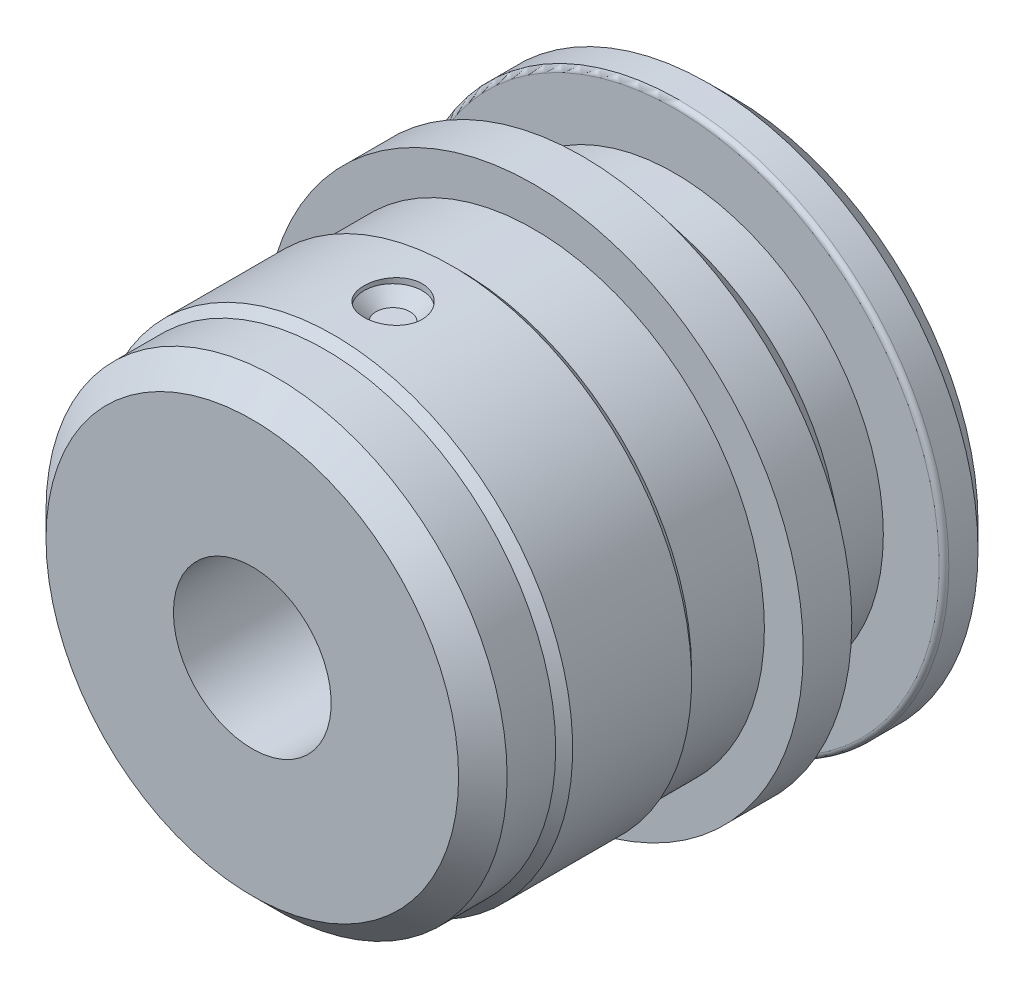
ISO-10303-21;
HEADER;
FILE_DESCRIPTION(('STEP AP214'),'2;1');
FILE_NAME('part.step','',(''),(''),'','','');
FILE_SCHEMA(('AUTOMOTIVE_DESIGN { 1 0 10303 214 1 1 1 1 }'));
ENDSEC;
DATA;
#1=APPLICATION_CONTEXT('core data for automotive mechanical design processes');
#2=APPLICATION_PROTOCOL_DEFINITION('international standard','automotive_design',2000,#1);
#3=PRODUCT_CONTEXT('',#1,'mechanical');
#4=PRODUCT('Part','Part','',(#3));
#5=PRODUCT_RELATED_PRODUCT_CATEGORY('part','',(#4));
#6=PRODUCT_DEFINITION_FORMATION('','',#4);
#7=PRODUCT_DEFINITION_CONTEXT('part definition',#1,'design');
#8=PRODUCT_DEFINITION('design','',#6,#7);
#9=PRODUCT_DEFINITION_SHAPE('','',#8);
#10=(LENGTH_UNIT() NAMED_UNIT(*) SI_UNIT(.MILLI.,.METRE.));
#11=(NAMED_UNIT(*) PLANE_ANGLE_UNIT() SI_UNIT($,.RADIAN.));
#12=(NAMED_UNIT(*) SI_UNIT($,.STERADIAN.) SOLID_ANGLE_UNIT());
#13=UNCERTAINTY_MEASURE_WITH_UNIT(LENGTH_MEASURE(1.E-05),#10,'distance_accuracy_value','');
#14=(GEOMETRIC_REPRESENTATION_CONTEXT(3) GLOBAL_UNCERTAINTY_ASSIGNED_CONTEXT((#13)) GLOBAL_UNIT_ASSIGNED_CONTEXT((#10,
#11,#12)) REPRESENTATION_CONTEXT('',''));
#15=CARTESIAN_POINT('',(0.,0.,0.));
#16=DIRECTION('',(0.,0.,1.));
#17=DIRECTION('',(1.,0.,0.));
#18=AXIS2_PLACEMENT_3D('',#15,#16,#17);
#19=CARTESIAN_POINT('',(11.1,0.,2.4));
#20=DIRECTION('',(0.,0.,-1.));
#21=DIRECTION('',(-1.,0.,0.));
#22=AXIS2_PLACEMENT_3D('',#19,#20,#21);
#23=PLANE('',#22);
#24=CARTESIAN_POINT('',(0.,0.,2.4));
#25=DIRECTION('',(0.,0.,-1.));
#26=DIRECTION('',(-1.,0.,0.));
#27=AXIS2_PLACEMENT_3D('',#24,#25,#26);
#28=CIRCLE('',#27,10.9);
#29=CARTESIAN_POINT('',(-10.9,0.,2.4));
#30=VERTEX_POINT('',#29);
#31=EDGE_CURVE('E86',#30,#30,#28,.F.);
#32=ORIENTED_EDGE('',*,*,#31,.T.);
#33=EDGE_LOOP('',(#32));
#34=FACE_BOUND('',#33,.T.);
#35=CARTESIAN_POINT('',(0.,0.,2.4));
#36=DIRECTION('',(0.,0.,-1.));
#37=DIRECTION('',(-1.,0.,0.));
#38=AXIS2_PLACEMENT_3D('',#35,#36,#37);
#39=CIRCLE('',#38,8.6);
#40=CARTESIAN_POINT('',(-8.6,0.,2.4));
#41=VERTEX_POINT('',#40);
#42=EDGE_CURVE('E85',#41,#41,#39,.T.);
#43=ORIENTED_EDGE('',*,*,#42,.T.);
#44=EDGE_LOOP('',(#43));
#45=FACE_BOUND('',#44,.T.);
#46=ADVANCED_FACE('F31',(#34,#45),#23,.F.);
#47=CARTESIAN_POINT('',(0.,0.,0.));
#48=DIRECTION('',(0.,0.,-1.));
#49=DIRECTION('',(-1.,0.,0.));
#50=AXIS2_PLACEMENT_3D('',#47,#48,#49);
#51=CYLINDRICAL_SURFACE('',#50,11.1);
#52=CARTESIAN_POINT('',(0.,0.,2.2));
#53=DIRECTION('',(0.,0.,-1.));
#54=DIRECTION('',(-1.,0.,0.));
#55=AXIS2_PLACEMENT_3D('',#52,#53,#54);
#56=CIRCLE('',#55,11.1);
#57=CARTESIAN_POINT('',(-11.1,0.,2.2));
#58=VERTEX_POINT('',#57);
#59=EDGE_CURVE('E91',#58,#58,#56,.T.);
#60=ORIENTED_EDGE('',*,*,#59,.T.);
#61=EDGE_LOOP('',(#60));
#62=FACE_BOUND('',#61,.T.);
#63=CARTESIAN_POINT('',(0.,0.,1.));
#64=DIRECTION('',(0.,0.,1.));
#65=DIRECTION('',(1.,0.,0.));
#66=AXIS2_PLACEMENT_3D('',#63,#64,#65);
#67=CIRCLE('',#66,11.1);
#68=CARTESIAN_POINT('',(11.1,0.,1.));
#69=VERTEX_POINT('',#68);
#70=EDGE_CURVE('E95',#69,#69,#67,.T.);
#71=ORIENTED_EDGE('',*,*,#70,.T.);
#72=EDGE_LOOP('',(#71));
#73=FACE_BOUND('',#72,.T.);
#74=ADVANCED_FACE('F220',(#62,#73),#51,.T.);
#75=CARTESIAN_POINT('',(11.1,0.,0.));
#76=DIRECTION('',(0.,0.,1.));
#77=DIRECTION('',(1.,0.,0.));
#78=AXIS2_PLACEMENT_3D('',#75,#76,#77);
#79=PLANE('',#78);
#80=CARTESIAN_POINT('',(0.,0.,0.));
#81=DIRECTION('',(0.,0.,1.));
#82=DIRECTION('',(1.,0.,0.));
#83=AXIS2_PLACEMENT_3D('',#80,#81,#82);
#84=CIRCLE('',#83,10.1);
#85=CARTESIAN_POINT('',(10.1,0.,0.));
#86=VERTEX_POINT('',#85);
#87=EDGE_CURVE('E99',#86,#86,#84,.F.);
#88=ORIENTED_EDGE('',*,*,#87,.T.);
#89=EDGE_LOOP('',(#88));
#90=FACE_BOUND('',#89,.T.);
#91=CARTESIAN_POINT('',(0.,0.,0.));
#92=DIRECTION('',(0.,0.,1.));
#93=DIRECTION('',(1.,0.,0.));
#94=AXIS2_PLACEMENT_3D('',#91,#92,#93);
#95=CIRCLE('',#94,7.1);
#96=CARTESIAN_POINT('',(7.1,0.,0.));
#97=VERTEX_POINT('',#96);
#98=EDGE_CURVE('E104',#97,#97,#95,.T.);
#99=ORIENTED_EDGE('',*,*,#98,.T.);
#100=EDGE_LOOP('',(#99));
#101=FACE_BOUND('',#100,.T.);
#102=ADVANCED_FACE('F225',(#90,#101),#79,.F.);
#103=CARTESIAN_POINT('',(0.,0.,0.));
#104=DIRECTION('',(0.,0.,-1.));
#105=DIRECTION('',(-1.,0.,0.));
#106=AXIS2_PLACEMENT_3D('',#103,#104,#105);
#107=CYLINDRICAL_SURFACE('',#106,6.1);
#108=CARTESIAN_POINT('',(0.,0.,0.999999999999999));
#109=DIRECTION('',(0.,0.,1.));
#110=DIRECTION('',(1.,0.,0.));
#111=AXIS2_PLACEMENT_3D('',#108,#109,#110);
#112=CIRCLE('',#111,6.1);
#113=CARTESIAN_POINT('',(6.1,0.,0.999999999999999));
#114=VERTEX_POINT('',#113);
#115=EDGE_CURVE('E107',#114,#114,#112,.F.);
#116=ORIENTED_EDGE('',*,*,#115,.T.);
#117=EDGE_LOOP('',(#116));
#118=FACE_BOUND('',#117,.T.);
#119=CARTESIAN_POINT('',(0.,0.,7.77653718043598));
#120=DIRECTION('',(0.,0.,-1.));
#121=DIRECTION('',(-1.,0.,0.));
#122=AXIS2_PLACEMENT_3D('',#119,#120,#121);
#123=CIRCLE('',#122,6.1);
#124=CARTESIAN_POINT('',(-6.1,0.,7.77653718043598));
#125=VERTEX_POINT('',#124);
#126=EDGE_CURVE('E116',#125,#125,#123,.T.);
#127=ORIENTED_EDGE('',*,*,#126,.F.);
#128=EDGE_LOOP('',(#127));
#129=FACE_BOUND('',#128,.T.);
#130=ADVANCED_FACE('F410',(#118,#129),#107,.F.);
#131=CARTESIAN_POINT('',(0.,0.,7.77653718043598));
#132=DIRECTION('',(0.,0.,-1.));
#133=DIRECTION('',(-1.,0.,0.));
#134=AXIS2_PLACEMENT_3D('',#131,#132,#133);
#135=CONICAL_SURFACE('',#134,6.1,1.30899693899575);
#136=CARTESIAN_POINT('',(0.,0.,8.5));
#137=DIRECTION('',(0.,0.,-1.));
#138=DIRECTION('',(-1.,0.,0.));
#139=AXIS2_PLACEMENT_3D('',#136,#137,#138);
#140=CIRCLE('',#139,3.4);
#141=CARTESIAN_POINT('',(-3.4,0.,8.5));
#142=VERTEX_POINT('',#141);
#143=EDGE_CURVE('E119',#142,#142,#140,.T.);
#144=ORIENTED_EDGE('',*,*,#143,.F.);
#145=EDGE_LOOP('',(#144));
#146=FACE_BOUND('',#145,.T.);
#147=ORIENTED_EDGE('',*,*,#126,.T.);
#148=EDGE_LOOP('',(#147));
#149=FACE_BOUND('',#148,.T.);
#150=ADVANCED_FACE('F401',(#146,#149),#135,.F.);
#151=CARTESIAN_POINT('',(0.,0.,0.));
#152=DIRECTION('',(0.,0.,-1.));
#153=DIRECTION('',(-1.,0.,0.));
#154=AXIS2_PLACEMENT_3D('',#151,#152,#153);
#155=CYLINDRICAL_SURFACE('',#154,3.4);
#156=CARTESIAN_POINT('',(0.,0.,10.));
#157=DIRECTION('',(0.,0.,-1.));
#158=DIRECTION('',(-1.,0.,0.));
#159=AXIS2_PLACEMENT_3D('',#156,#157,#158);
#160=CIRCLE('',#159,3.4);
#161=CARTESIAN_POINT('',(-3.4,0.,10.));
#162=VERTEX_POINT('',#161);
#163=EDGE_CURVE('E122',#162,#162,#160,.T.);
#164=ORIENTED_EDGE('',*,*,#163,.F.);
#165=EDGE_LOOP('',(#164));
#166=FACE_BOUND('',#165,.T.);
#167=ORIENTED_EDGE('',*,*,#143,.T.);
#168=EDGE_LOOP('',(#167));
#169=FACE_BOUND('',#168,.T.);
#170=ADVANCED_FACE('F392',(#166,#169),#155,.F.);
#171=CARTESIAN_POINT('',(4.4,0.,10.));
#172=DIRECTION('',(0.,0.,-1.));
#173=DIRECTION('',(-1.,0.,0.));
#174=AXIS2_PLACEMENT_3D('',#171,#172,#173);
#175=PLANE('',#174);
#176=CARTESIAN_POINT('',(0.,0.,10.));
#177=DIRECTION('',(0.,0.,-1.));
#178=DIRECTION('',(-1.,0.,0.));
#179=AXIS2_PLACEMENT_3D('',#176,#177,#178);
#180=CIRCLE('',#179,4.4);
#181=CARTESIAN_POINT('',(-4.4,0.,10.));
#182=VERTEX_POINT('',#181);
#183=EDGE_CURVE('E125',#182,#182,#180,.T.);
#184=ORIENTED_EDGE('',*,*,#183,.F.);
#185=EDGE_LOOP('',(#184));
#186=FACE_BOUND('',#185,.T.);
#187=ORIENTED_EDGE('',*,*,#163,.T.);
#188=EDGE_LOOP('',(#187));
#189=FACE_BOUND('',#188,.T.);
#190=ADVANCED_FACE('F383',(#186,#189),#175,.F.);
#191=CARTESIAN_POINT('',(0.,0.,0.));
#192=DIRECTION('',(0.,0.,-1.));
#193=DIRECTION('',(-1.,0.,0.));
#194=AXIS2_PLACEMENT_3D('',#191,#192,#193);
#195=CYLINDRICAL_SURFACE('',#194,4.4);
#196=CARTESIAN_POINT('',(0.,0.,11.8));
#197=DIRECTION('',(0.,0.,-1.));
#198=DIRECTION('',(-1.,0.,0.));
#199=AXIS2_PLACEMENT_3D('',#196,#197,#198);
#200=CIRCLE('',#199,4.4);
#201=CARTESIAN_POINT('',(-4.4,0.,11.8));
#202=VERTEX_POINT('',#201);
#203=EDGE_CURVE('E128',#202,#202,#200,.T.);
#204=ORIENTED_EDGE('',*,*,#203,.F.);
#205=EDGE_LOOP('',(#204));
#206=FACE_BOUND('',#205,.T.);
#207=ORIENTED_EDGE('',*,*,#183,.T.);
#208=EDGE_LOOP('',(#207));
#209=FACE_BOUND('',#208,.T.);
#210=ADVANCED_FACE('F374',(#206,#209),#195,.F.);
#211=CARTESIAN_POINT('',(3.25,0.,11.8));
#212=DIRECTION('',(0.,0.,1.));
#213=DIRECTION('',(1.,0.,0.));
#214=AXIS2_PLACEMENT_3D('',#211,#212,#213);
#215=PLANE('',#214);
#216=CARTESIAN_POINT('',(0.,0.,11.8));
#217=DIRECTION('',(0.,0.,-1.));
#218=DIRECTION('',(-1.,0.,0.));
#219=AXIS2_PLACEMENT_3D('',#216,#217,#218);
#220=CIRCLE('',#219,3.25);
#221=CARTESIAN_POINT('',(-3.25,0.,11.8));
#222=VERTEX_POINT('',#221);
#223=EDGE_CURVE('E131',#222,#222,#220,.T.);
#224=ORIENTED_EDGE('',*,*,#223,.F.);
#225=EDGE_LOOP('',(#224));
#226=FACE_BOUND('',#225,.T.);
#227=ORIENTED_EDGE('',*,*,#203,.T.);
#228=EDGE_LOOP('',(#227));
#229=FACE_BOUND('',#228,.T.);
#230=ADVANCED_FACE('F365',(#226,#229),#215,.F.);
#231=CARTESIAN_POINT('',(0.,0.,0.));
#232=DIRECTION('',(0.,0.,-1.));
#233=DIRECTION('',(-1.,0.,0.));
#234=AXIS2_PLACEMENT_3D('',#231,#232,#233);
#235=CYLINDRICAL_SURFACE('',#234,3.25);
#236=CARTESIAN_POINT('',(0.,0.,19.8));
#237=DIRECTION('',(0.,0.,-1.));
#238=DIRECTION('',(-1.,0.,0.));
#239=AXIS2_PLACEMENT_3D('',#236,#237,#238);
#240=CIRCLE('',#239,3.25);
#241=CARTESIAN_POINT('',(-3.25,0.,19.8));
#242=VERTEX_POINT('',#241);
#243=EDGE_CURVE('E134',#242,#242,#240,.T.);
#244=ORIENTED_EDGE('',*,*,#243,.F.);
#245=EDGE_LOOP('',(#244));
#246=FACE_BOUND('',#245,.T.);
#247=ORIENTED_EDGE('',*,*,#223,.T.);
#248=EDGE_LOOP('',(#247));
#249=FACE_BOUND('',#248,.T.);
#250=ADVANCED_FACE('F216',(#246,#249),#235,.F.);
#251=CARTESIAN_POINT('',(9.5,0.,19.8));
#252=DIRECTION('',(0.,0.,-1.));
#253=DIRECTION('',(-1.,0.,0.));
#254=AXIS2_PLACEMENT_3D('',#251,#252,#253);
#255=PLANE('',#254);
#256=CARTESIAN_POINT('',(0.,0.,19.8));
#257=DIRECTION('',(0.,0.,-1.));
#258=DIRECTION('',(-1.,0.,0.));
#259=AXIS2_PLACEMENT_3D('',#256,#257,#258);
#260=CIRCLE('',#259,8.49999999999999);
#261=CARTESIAN_POINT('',(-8.49999999999999,0.,19.8));
#262=VERTEX_POINT('',#261);
#263=EDGE_CURVE('E110',#262,#262,#260,.F.);
#264=ORIENTED_EDGE('',*,*,#263,.T.);
#265=EDGE_LOOP('',(#264));
#266=FACE_BOUND('',#265,.T.);
#267=ORIENTED_EDGE('',*,*,#243,.T.);
#268=EDGE_LOOP('',(#267));
#269=FACE_BOUND('',#268,.T.);
#270=ADVANCED_FACE('F210',(#266,#269),#255,.F.);
#271=CARTESIAN_POINT('',(0.,0.,0.));
#272=DIRECTION('',(0.,0.,-1.));
#273=DIRECTION('',(-1.,0.,0.));
#274=AXIS2_PLACEMENT_3D('',#271,#272,#273);
#275=CYLINDRICAL_SURFACE('',#274,9.5);
#276=CARTESIAN_POINT('',(0.,0.,18.8));
#277=DIRECTION('',(0.,0.,-1.));
#278=DIRECTION('',(-1.,0.,0.));
#279=AXIS2_PLACEMENT_3D('',#276,#277,#278);
#280=CIRCLE('',#279,9.5);
#281=CARTESIAN_POINT('',(-9.5,0.,18.8));
#282=VERTEX_POINT('',#281);
#283=EDGE_CURVE('E113',#282,#282,#280,.T.);
#284=ORIENTED_EDGE('',*,*,#283,.T.);
#285=EDGE_LOOP('',(#284));
#286=FACE_BOUND('',#285,.T.);
#287=CARTESIAN_POINT('',(0.,0.,16.8));
#288=DIRECTION('',(0.,0.,-1.));
#289=DIRECTION('',(-1.,0.,0.));
#290=AXIS2_PLACEMENT_3D('',#287,#288,#289);
#291=CIRCLE('',#290,9.5);
#292=CARTESIAN_POINT('',(-9.5,0.,16.8));
#293=VERTEX_POINT('',#292);
#294=EDGE_CURVE('E137',#293,#293,#291,.T.);
#295=ORIENTED_EDGE('',*,*,#294,.F.);
#296=EDGE_LOOP('',(#295));
#297=FACE_BOUND('',#296,.T.);
#298=ADVANCED_FACE('F206',(#286,#297),#275,.T.);
#299=CARTESIAN_POINT('',(0.,0.,16.8));
#300=DIRECTION('',(0.,0.,-1.));
#301=DIRECTION('',(-1.,0.,0.));
#302=AXIS2_PLACEMENT_3D('',#299,#300,#301);
#303=CONICAL_SURFACE('',#302,9.5,0.785398163397443);
#304=CARTESIAN_POINT('',(0.,0.,16.45));
#305=DIRECTION('',(0.,0.,-1.));
#306=DIRECTION('',(-1.,0.,0.));
#307=AXIS2_PLACEMENT_3D('',#304,#305,#306);
#308=CIRCLE('',#307,9.85);
#309=CARTESIAN_POINT('',(-9.85,0.,16.45));
#310=VERTEX_POINT('',#309);
#311=EDGE_CURVE('E140',#310,#310,#308,.T.);
#312=ORIENTED_EDGE('',*,*,#311,.F.);
#313=EDGE_LOOP('',(#312));
#314=FACE_BOUND('',#313,.T.);
#315=ORIENTED_EDGE('',*,*,#294,.T.);
#316=EDGE_LOOP('',(#315));
#317=FACE_BOUND('',#316,.T.);
#318=ADVANCED_FACE('F200',(#314,#317),#303,.T.);
#319=CARTESIAN_POINT('',(0.,0.,0.));
#320=DIRECTION('',(0.,0.,-1.));
#321=DIRECTION('',(-1.,0.,0.));
#322=AXIS2_PLACEMENT_3D('',#319,#320,#321);
#323=CYLINDRICAL_SURFACE('',#322,9.85);
#324=CARTESIAN_POINT('',(0.,-9.85,12.8));
#325=CARTESIAN_POINT('',(-0.0671377185985207,-9.84999908293056,12.8000028606161));
#326=CARTESIAN_POINT('',(-0.134317729761524,-9.84930632720313,12.8056533348861));
#327=CARTESIAN_POINT('',(-0.266809321399453,-9.84660941983754,12.8281055312784));
#328=CARTESIAN_POINT('',(-0.332118860467236,-9.84460388841967,12.8449189864056));
#329=CARTESIAN_POINT('',(-0.458932165591949,-9.8395074269213,12.8891952533967));
#330=CARTESIAN_POINT('',(-0.520438425625705,-9.83641721718293,12.9166509989034));
#331=CARTESIAN_POINT('',(-0.637958284699054,-9.82949534897751,12.9814172559376));
#332=CARTESIAN_POINT('',(-0.693972844321678,-9.8256638205284,13.0187260397847));
#333=CARTESIAN_POINT('',(-0.799224743193288,-9.81766484518081,13.1023484533448));
#334=CARTESIAN_POINT('',(-0.848429163515683,-9.81349591114417,13.1487033785698));
#335=CARTESIAN_POINT('',(-0.938380616288529,-9.80530402197336,13.2490136218257));
#336=CARTESIAN_POINT('',(-0.979127223481776,-9.80128107418774,13.3029693217932));
#337=CARTESIAN_POINT('',(-1.05112827113454,-9.79382195364935,13.4171624542512));
#338=CARTESIAN_POINT('',(-1.08235200238518,-9.79038769456096,13.4774193852716));
#339=CARTESIAN_POINT('',(-1.13422486131294,-9.78451427231854,13.602370308685));
#340=CARTESIAN_POINT('',(-1.15487437033634,-9.78207507327955,13.6670641409711));
#341=CARTESIAN_POINT('',(-1.18491289113473,-9.77848206482136,13.7987114825229));
#342=CARTESIAN_POINT('',(-1.19435737113612,-9.77732192571284,13.8656521596227));
#343=CARTESIAN_POINT('',(-1.20188935333566,-9.77639898988791,14.0001776667796));
#344=CARTESIAN_POINT('',(-1.19997729013388,-9.77663613969908,14.0677624720879));
#345=CARTESIAN_POINT('',(-1.18489602004375,-9.77847519504789,14.2012717708085));
#346=CARTESIAN_POINT('',(-1.17178783855338,-9.78006970203688,14.2672032740522));
#347=CARTESIAN_POINT('',(-1.13478160337879,-9.78443227006642,14.395923719483));
#348=CARTESIAN_POINT('',(-1.11088334111317,-9.78720035379313,14.4587126008945));
#349=CARTESIAN_POINT('',(-1.05290949051725,-9.7936065898717,14.5795554827863));
#350=CARTESIAN_POINT('',(-1.01880730612138,-9.79724701093192,14.637596598745));
#351=CARTESIAN_POINT('',(-0.941412684469814,-9.8049859636982,14.74715521603));
#352=CARTESIAN_POINT('',(-0.898119847834306,-9.80908451530866,14.7986724337048));
#353=CARTESIAN_POINT('',(-0.803234274918892,-9.81731082809601,14.8940751374107));
#354=CARTESIAN_POINT('',(-0.75158892359161,-9.82143860441445,14.937908309267));
#355=CARTESIAN_POINT('',(-0.641645716504017,-9.82923306959032,15.016291587785));
#356=CARTESIAN_POINT('',(-0.583347846683675,-9.83289975747321,15.0508416748264));
#357=CARTESIAN_POINT('',(-0.46171469061125,-9.83936102492705,15.1096777750772));
#358=CARTESIAN_POINT('',(-0.398377846398791,-9.84215533344873,15.1339605990649));
#359=CARTESIAN_POINT('',(-0.268484100338869,-9.84655450607394,15.1715317873972));
#360=CARTESIAN_POINT('',(-0.201927341783418,-9.84815942305578,15.1848206405179));
#361=CARTESIAN_POINT('',(-0.0679355003103079,-9.8499921206294,15.1999590618947));
#362=CARTESIAN_POINT('',(-0.000508675264120705,-9.85022857878567,15.2018807126924));
#363=CARTESIAN_POINT('',(0.133706056938548,-9.84932112311176,15.1944202820746));
#364=CARTESIAN_POINT('',(0.20049397697724,-9.84817723717276,15.1850384290573));
#365=CARTESIAN_POINT('',(0.33132298797583,-9.84464304687738,15.1552971788268));
#366=CARTESIAN_POINT('',(0.395371986809384,-9.84225663597672,15.1349720656113));
#367=CARTESIAN_POINT('',(0.51915222018376,-9.83650464302615,15.083956837001));
#368=CARTESIAN_POINT('',(0.578883314762917,-9.83313902925386,15.0532663858042));
#369=CARTESIAN_POINT('',(0.692654673183801,-9.82578238744328,14.9822166657875));
#370=CARTESIAN_POINT('',(0.746665558161899,-9.82178837005377,14.9418106676151));
#371=CARTESIAN_POINT('',(0.847164635228302,-9.81363129231413,14.8525430641395));
#372=CARTESIAN_POINT('',(0.893652544073803,-9.80946822560661,14.8036811406108));
#373=CARTESIAN_POINT('',(0.978041039516859,-9.80141556980202,14.6985715869543));
#374=CARTESIAN_POINT('',(1.01589390886892,-9.79752757853287,14.6422855062806));
#375=CARTESIAN_POINT('',(1.08160839752346,-9.79049131260463,14.5241123995343));
#376=CARTESIAN_POINT('',(1.10947020859656,-9.78734302374792,14.462225480994));
#377=CARTESIAN_POINT('',(1.15433406632193,-9.78215339772391,14.3347627463981));
#378=CARTESIAN_POINT('',(1.17136322234709,-9.7801092992047,14.2691965894044));
#379=CARTESIAN_POINT('',(1.1941657728976,-9.7773514915479,14.1361089406534));
#380=CARTESIAN_POINT('',(1.1999396627369,-9.77663772386609,14.068587535074));
#381=CARTESIAN_POINT('',(1.20005900351757,-9.77662303762594,13.933980724396));
#382=CARTESIAN_POINT('',(1.19447941730302,-9.77731285172967,13.8668953743946));
#383=CARTESIAN_POINT('',(1.17220871453953,-9.78000770334934,13.7346234007073));
#384=CARTESIAN_POINT('',(1.15551759499052,-9.78201274122038,13.6694367775341));
#385=CARTESIAN_POINT('',(1.11152069391402,-9.78710929833492,13.5428212615948));
#386=CARTESIAN_POINT('',(1.08421833218436,-9.79020046750858,13.4813911655472));
#387=CARTESIAN_POINT('',(1.01978135822545,-9.79712158807961,13.3639723969704));
#388=CARTESIAN_POINT('',(0.982646647259557,-9.80095154689582,13.3079837790924));
#389=CARTESIAN_POINT('',(0.899320411809733,-9.80894901369803,13.2026538843235));
#390=CARTESIAN_POINT('',(0.853072999585296,-9.81311850645845,13.1533569679635));
#391=CARTESIAN_POINT('',(0.752950230093834,-9.82130762172921,13.0631942983423));
#392=CARTESIAN_POINT('',(0.699073073319642,-9.82532720860025,13.0223305396797));
#393=CARTESIAN_POINT('',(0.584997669833548,-9.83277957590307,12.9500693031996));
#394=CARTESIAN_POINT('',(0.524777257633643,-9.83621018054586,12.918706610989));
#395=CARTESIAN_POINT('',(0.399917027781265,-9.84207583512778,12.8665833640675));
#396=CARTESIAN_POINT('',(0.335282125484097,-9.84451197193271,12.8458112285934));
#397=CARTESIAN_POINT('',(0.225256910035417,-9.84752347186931,12.8204599274828));
#398=CARTESIAN_POINT('',(0.180561835431385,-9.84844767262355,12.8127984050464));
#399=CARTESIAN_POINT('',(0.090584256447808,-9.84968624399239,12.8025674937005));
#400=CARTESIAN_POINT('',(0.0453017561099382,-9.85000061880054,12.7999980697746));
#401=CARTESIAN_POINT('',(0.,-9.85,12.8));
#402=B_SPLINE_CURVE_WITH_KNOTS('',3,(#324,#325,#326,#327,#328,#329,#330,#331,#332,#333,#334,
#335,#336,#337,#338,#339,#340,#341,#342,#343,#344,#345,#346,#347,#348,#349,#350,#351,#352,#353,
#354,#355,#356,#357,#358,#359,#360,#361,#362,#363,#364,#365,#366,#367,#368,#369,#370,#371,#372,
#373,#374,#375,#376,#377,#378,#379,#380,#381,#382,#383,#384,#385,#386,#387,#388,#389,#390,#391,
#392,#393,#394,#395,#396,#397,#398,#399,#400,#401),.UNSPECIFIED.,.T.,.F.,(4,2,2,2,2,2,2,2,2,2,2,
2,2,2,2,2,2,2,2,2,2,2,2,2,2,2,2,2,2,2,2,2,2,2,2,2,2,2,4),(0.,0.201247689589877,
0.402707238910202,0.604033249942407,0.805323982888943,1.0075560584704,1.20979829977966,
1.41268599569169,1.61556637419407,1.81743818733101,2.01930227514757,2.22007305594732,
2.42084771798253,2.62215031750565,2.82346166642505,3.02609441849326,3.22872759883169,
3.43142367501863,3.63411073914626,3.83551111946903,4.03690743037027,4.237676429844,
4.4384519341806,4.64021314650143,4.84198195343924,5.04484009256853,5.24769433778484,
5.45003890987788,5.65237457713001,5.85337863143019,6.05438274000059,6.25532212248441,
6.45626352288154,6.65847796019348,6.86074017030486,7.06373420030186,7.26650577786762,
7.40230033025888,7.53809394883577),.UNSPECIFIED.);
#403=CARTESIAN_POINT('',(0.,-9.85,12.8));
#404=VERTEX_POINT('',#403);
#405=EDGE_CURVE('E49',#404,#404,#402,.T.);
#406=ORIENTED_EDGE('',*,*,#405,.T.);
#407=EDGE_LOOP('',(#406));
#408=FACE_BOUND('',#407,.T.);
#409=CARTESIAN_POINT('',(0.,9.85,15.2));
#410=CARTESIAN_POINT('',(-0.0671377185985173,9.84999908293056,15.1999971393839));
#411=CARTESIAN_POINT('',(-0.13431772976152,9.84930632720313,15.1943466651139));
#412=CARTESIAN_POINT('',(-0.266809321399449,9.84660941983754,15.1718944687216));
#413=CARTESIAN_POINT('',(-0.332118860467232,9.84460388841967,15.1550810135944));
#414=CARTESIAN_POINT('',(-0.458932165591945,9.8395074269213,15.1108047466033));
#415=CARTESIAN_POINT('',(-0.520438425625702,9.83641721718293,15.0833490010966));
#416=CARTESIAN_POINT('',(-0.63795828469905,9.82949534897751,15.0185827440624));
#417=CARTESIAN_POINT('',(-0.693972844321674,9.8256638205284,14.9812739602153));
#418=CARTESIAN_POINT('',(-0.799224743193284,9.81766484518081,14.8976515466552));
#419=CARTESIAN_POINT('',(-0.848429163515679,9.81349591114417,14.8512966214302));
#420=CARTESIAN_POINT('',(-0.938380616288525,9.80530402197336,14.7509863781743));
#421=CARTESIAN_POINT('',(-0.979127223481772,9.80128107418774,14.6970306782068));
#422=CARTESIAN_POINT('',(-1.05112827113454,9.79382195364935,14.5828375457488));
#423=CARTESIAN_POINT('',(-1.08235200238518,9.79038769456096,14.5225806147284));
#424=CARTESIAN_POINT('',(-1.13422486131294,9.78451427231854,14.397629691315));
#425=CARTESIAN_POINT('',(-1.15487437033633,9.78207507327955,14.3329358590289));
#426=CARTESIAN_POINT('',(-1.18491289113473,9.77848206482136,14.2012885174771));
#427=CARTESIAN_POINT('',(-1.19435737113611,9.77732192571284,14.1343478403773));
#428=CARTESIAN_POINT('',(-1.20188935333566,9.77639898988791,13.9998223332204));
#429=CARTESIAN_POINT('',(-1.19997729013387,9.77663613969909,13.9322375279121));
#430=CARTESIAN_POINT('',(-1.18489602004375,9.77847519504789,13.7987282291915));
#431=CARTESIAN_POINT('',(-1.17178783855338,9.78006970203689,13.7327967259478));
#432=CARTESIAN_POINT('',(-1.13478160337879,9.78443227006642,13.604076280517));
#433=CARTESIAN_POINT('',(-1.11088334111317,9.78720035379313,13.5412873991055));
#434=CARTESIAN_POINT('',(-1.05290949051725,9.7936065898717,13.4204445172137));
#435=CARTESIAN_POINT('',(-1.01880730612137,9.79724701093192,13.362403401255));
#436=CARTESIAN_POINT('',(-0.94141268446981,9.8049859636982,13.25284478397));
#437=CARTESIAN_POINT('',(-0.898119847834303,9.80908451530866,13.2013275662952));
#438=CARTESIAN_POINT('',(-0.803234274918888,9.81731082809601,13.1059248625893));
#439=CARTESIAN_POINT('',(-0.751588923591606,9.82143860441445,13.062091690733));
#440=CARTESIAN_POINT('',(-0.641645716504013,9.82923306959032,12.983708412215));
#441=CARTESIAN_POINT('',(-0.583347846683671,9.83289975747321,12.9491583251736));
#442=CARTESIAN_POINT('',(-0.461714690611246,9.83936102492705,12.8903222249228));
#443=CARTESIAN_POINT('',(-0.398377846398787,9.84215533344873,12.8660394009351));
#444=CARTESIAN_POINT('',(-0.268484100338865,9.84655450607394,12.8284682126028));
#445=CARTESIAN_POINT('',(-0.201927341783415,9.84815942305578,12.8151793594821));
#446=CARTESIAN_POINT('',(-0.0679355003103041,9.8499921206294,12.8000409381053));
#447=CARTESIAN_POINT('',(-0.000508675264116856,9.85022857878567,12.7981192873076));
#448=CARTESIAN_POINT('',(0.133706056938552,9.84932112311176,12.8055797179254));
#449=CARTESIAN_POINT('',(0.200493976977243,9.84817723717276,12.8149615709427));
#450=CARTESIAN_POINT('',(0.331322987975834,9.84464304687738,12.8447028211732));
#451=CARTESIAN_POINT('',(0.395371986809388,9.84225663597672,12.8650279343887));
#452=CARTESIAN_POINT('',(0.519152220183763,9.83650464302615,12.916043162999));
#453=CARTESIAN_POINT('',(0.57888331476292,9.83313902925386,12.9467336141958));
#454=CARTESIAN_POINT('',(0.692654673183805,9.82578238744328,13.0177833342125));
#455=CARTESIAN_POINT('',(0.746665558161903,9.82178837005377,13.0581893323849));
#456=CARTESIAN_POINT('',(0.847164635228305,9.81363129231413,13.1474569358605));
#457=CARTESIAN_POINT('',(0.893652544073807,9.80946822560661,13.1963188593892));
#458=CARTESIAN_POINT('',(0.978041039516863,9.80141556980202,13.3014284130457));
#459=CARTESIAN_POINT('',(1.01589390886892,9.79752757853287,13.3577144937195));
#460=CARTESIAN_POINT('',(1.08160839752347,9.79049131260463,13.4758876004657));
#461=CARTESIAN_POINT('',(1.10947020859656,9.78734302374792,13.537774519006));
#462=CARTESIAN_POINT('',(1.15433406632193,9.78215339772391,13.6652372536019));
#463=CARTESIAN_POINT('',(1.1713632223471,9.7801092992047,13.7308034105956));
#464=CARTESIAN_POINT('',(1.1941657728976,9.7773514915479,13.8638910593466));
#465=CARTESIAN_POINT('',(1.19993966273691,9.77663772386609,13.931412464926));
#466=CARTESIAN_POINT('',(1.20005900351758,9.77662303762593,14.066019275604));
#467=CARTESIAN_POINT('',(1.19447941730303,9.77731285172967,14.1331046256054));
#468=CARTESIAN_POINT('',(1.17220871453953,9.78000770334934,14.2653765992927));
#469=CARTESIAN_POINT('',(1.15551759499053,9.78201274122038,14.3305632224659));
#470=CARTESIAN_POINT('',(1.11152069391402,9.78710929833492,14.4571787384052));
#471=CARTESIAN_POINT('',(1.08421833218437,9.79020046750858,14.5186088344528));
#472=CARTESIAN_POINT('',(1.01978135822545,9.79712158807961,14.6360276030296));
#473=CARTESIAN_POINT('',(0.98264664725956,9.80095154689582,14.6920162209077));
#474=CARTESIAN_POINT('',(0.899320411809736,9.80894901369803,14.7973461156765));
#475=CARTESIAN_POINT('',(0.853072999585298,9.81311850645845,14.8466430320365));
#476=CARTESIAN_POINT('',(0.752950230093836,9.82130762172921,14.9368057016577));
#477=CARTESIAN_POINT('',(0.699073073319644,9.82532720860025,14.9776694603203));
#478=CARTESIAN_POINT('',(0.584997669833551,9.83277957590307,15.0499306968004));
#479=CARTESIAN_POINT('',(0.524777257633645,9.83621018054586,15.081293389011));
#480=CARTESIAN_POINT('',(0.399917027781267,9.84207583512778,15.1334166359325));
#481=CARTESIAN_POINT('',(0.335282125484099,9.84451197193271,15.1541887714066));
#482=CARTESIAN_POINT('',(0.225256910035419,9.84752347186931,15.1795400725172));
#483=CARTESIAN_POINT('',(0.180561835431387,9.84844767262355,15.1872015949536));
#484=CARTESIAN_POINT('',(0.0905842564478107,9.84968624399239,15.1974325062995));
#485=CARTESIAN_POINT('',(0.0453017561099412,9.85000061880054,15.2000019302254));
#486=CARTESIAN_POINT('',(0.,9.85,15.2));
#487=B_SPLINE_CURVE_WITH_KNOTS('',3,(#409,#410,#411,#412,#413,#414,#415,#416,#417,#418,#419,
#420,#421,#422,#423,#424,#425,#426,#427,#428,#429,#430,#431,#432,#433,#434,#435,#436,#437,#438,
#439,#440,#441,#442,#443,#444,#445,#446,#447,#448,#449,#450,#451,#452,#453,#454,#455,#456,#457,
#458,#459,#460,#461,#462,#463,#464,#465,#466,#467,#468,#469,#470,#471,#472,#473,#474,#475,#476,
#477,#478,#479,#480,#481,#482,#483,#484,#485,#486),.UNSPECIFIED.,.T.,.F.,(4,2,2,2,2,2,2,2,2,2,2,
2,2,2,2,2,2,2,2,2,2,2,2,2,2,2,2,2,2,2,2,2,2,2,2,2,2,2,4),(0.,0.201247689589877,
0.402707238910201,0.604033249942406,0.805323982888943,1.0075560584704,1.20979829977966,
1.4126859956917,1.61556637419407,1.81743818733101,2.01930227514757,2.22007305594732,
2.42084771798253,2.62215031750565,2.82346166642505,3.02609441849325,3.22872759883169,
3.43142367501863,3.63411073914626,3.83551111946903,4.03690743037027,4.237676429844,
4.4384519341806,4.64021314650143,4.84198195343923,5.04484009256853,5.24769433778484,
5.45003890987788,5.65237457713002,5.85337863143019,6.05438274000059,6.25532212248441,
6.45626352288154,6.65847796019348,6.86074017030487,7.06373420030186,7.26650577786762,
7.40230033025888,7.53809394883576),.UNSPECIFIED.);
#488=CARTESIAN_POINT('',(0.,9.85,15.2));
#489=VERTEX_POINT('',#488);
#490=EDGE_CURVE('E55',#489,#489,#487,.T.);
#491=ORIENTED_EDGE('',*,*,#490,.T.);
#492=EDGE_LOOP('',(#491));
#493=FACE_BOUND('',#492,.T.);
#494=CARTESIAN_POINT('',(0.,0.,11.55));
#495=DIRECTION('',(0.,0.,-1.));
#496=DIRECTION('',(-1.,0.,0.));
#497=AXIS2_PLACEMENT_3D('',#494,#495,#496);
#498=CIRCLE('',#497,9.85);
#499=CARTESIAN_POINT('',(-9.85,0.,11.55));
#500=VERTEX_POINT('',#499);
#501=EDGE_CURVE('E143',#500,#500,#498,.T.);
#502=ORIENTED_EDGE('',*,*,#501,.F.);
#503=EDGE_LOOP('',(#502));
#504=FACE_BOUND('',#503,.T.);
#505=ORIENTED_EDGE('',*,*,#311,.T.);
#506=EDGE_LOOP('',(#505));
#507=FACE_BOUND('',#506,.T.);
#508=ADVANCED_FACE('F57',(#408,#493,#504,#507),#323,.T.);
#509=CARTESIAN_POINT('',(0.,0.,11.55));
#510=DIRECTION('',(0.,0.,1.));
#511=DIRECTION('',(1.,0.,0.));
#512=AXIS2_PLACEMENT_3D('',#509,#510,#511);
#513=CONICAL_SURFACE('',#512,9.85,0.785398163397451);
#514=CARTESIAN_POINT('',(0.,0.,11.2));
#515=DIRECTION('',(0.,0.,-1.));
#516=DIRECTION('',(-1.,0.,0.));
#517=AXIS2_PLACEMENT_3D('',#514,#515,#516);
#518=CIRCLE('',#517,9.5);
#519=CARTESIAN_POINT('',(-9.5,0.,11.2));
#520=VERTEX_POINT('',#519);
#521=EDGE_CURVE('E146',#520,#520,#518,.T.);
#522=ORIENTED_EDGE('',*,*,#521,.F.);
#523=EDGE_LOOP('',(#522));
#524=FACE_BOUND('',#523,.T.);
#525=ORIENTED_EDGE('',*,*,#501,.T.);
#526=EDGE_LOOP('',(#525));
#527=FACE_BOUND('',#526,.T.);
#528=ADVANCED_FACE('F190',(#524,#527),#513,.T.);
#529=CARTESIAN_POINT('',(0.,0.,0.));
#530=DIRECTION('',(0.,0.,-1.));
#531=DIRECTION('',(-1.,0.,0.));
#532=AXIS2_PLACEMENT_3D('',#529,#530,#531);
#533=CYLINDRICAL_SURFACE('',#532,9.5);
#534=CARTESIAN_POINT('',(0.,0.,8.2));
#535=DIRECTION('',(0.,0.,-1.));
#536=DIRECTION('',(-1.,0.,0.));
#537=AXIS2_PLACEMENT_3D('',#534,#535,#536);
#538=CIRCLE('',#537,9.5);
#539=CARTESIAN_POINT('',(-9.5,0.,8.2));
#540=VERTEX_POINT('',#539);
#541=EDGE_CURVE('E149',#540,#540,#538,.T.);
#542=ORIENTED_EDGE('',*,*,#541,.F.);
#543=EDGE_LOOP('',(#542));
#544=FACE_BOUND('',#543,.T.);
#545=ORIENTED_EDGE('',*,*,#521,.T.);
#546=EDGE_LOOP('',(#545));
#547=FACE_BOUND('',#546,.T.);
#548=ADVANCED_FACE('F184',(#544,#547),#533,.T.);
#549=CARTESIAN_POINT('',(11.1,0.,8.2));
#550=DIRECTION('',(0.,0.,-1.));
#551=DIRECTION('',(-1.,0.,0.));
#552=AXIS2_PLACEMENT_3D('',#549,#550,#551);
#553=PLANE('',#552);
#554=CARTESIAN_POINT('',(0.,0.,8.2));
#555=DIRECTION('',(0.,0.,-1.));
#556=DIRECTION('',(-1.,0.,0.));
#557=AXIS2_PLACEMENT_3D('',#554,#555,#556);
#558=CIRCLE('',#557,11.1);
#559=CARTESIAN_POINT('',(-11.1,0.,8.2));
#560=VERTEX_POINT('',#559);
#561=EDGE_CURVE('E152',#560,#560,#558,.T.);
#562=ORIENTED_EDGE('',*,*,#561,.F.);
#563=EDGE_LOOP('',(#562));
#564=FACE_BOUND('',#563,.T.);
#565=ORIENTED_EDGE('',*,*,#541,.T.);
#566=EDGE_LOOP('',(#565));
#567=FACE_BOUND('',#566,.T.);
#568=ADVANCED_FACE('F178',(#564,#567),#553,.F.);
#569=CARTESIAN_POINT('',(0.,0.,0.));
#570=DIRECTION('',(0.,0.,-1.));
#571=DIRECTION('',(-1.,0.,0.));
#572=AXIS2_PLACEMENT_3D('',#569,#570,#571);
#573=CYLINDRICAL_SURFACE('',#572,11.1);
#574=CARTESIAN_POINT('',(0.,0.,6.2));
#575=DIRECTION('',(0.,0.,-1.));
#576=DIRECTION('',(-1.,0.,0.));
#577=AXIS2_PLACEMENT_3D('',#574,#575,#576);
#578=CIRCLE('',#577,11.1);
#579=CARTESIAN_POINT('',(-11.1,0.,6.2));
#580=VERTEX_POINT('',#579);
#581=EDGE_CURVE('E155',#580,#580,#578,.T.);
#582=ORIENTED_EDGE('',*,*,#581,.F.);
#583=EDGE_LOOP('',(#582));
#584=FACE_BOUND('',#583,.T.);
#585=ORIENTED_EDGE('',*,*,#561,.T.);
#586=EDGE_LOOP('',(#585));
#587=FACE_BOUND('',#586,.T.);
#588=ADVANCED_FACE('F173',(#584,#587),#573,.T.);
#589=CARTESIAN_POINT('',(0.,0.,6.2));
#590=DIRECTION('',(0.,0.,1.));
#591=DIRECTION('',(1.,0.,0.));
#592=AXIS2_PLACEMENT_3D('',#589,#590,#591);
#593=CONICAL_SURFACE('',#592,11.1,0.896055384571345);
#594=CARTESIAN_POINT('',(0.,0.,4.2));
#595=DIRECTION('',(0.,0.,-1.));
#596=DIRECTION('',(-1.,0.,0.));
#597=AXIS2_PLACEMENT_3D('',#594,#595,#596);
#598=CIRCLE('',#597,8.6);
#599=CARTESIAN_POINT('',(-8.6,0.,4.2));
#600=VERTEX_POINT('',#599);
#601=EDGE_CURVE('E158',#600,#600,#598,.T.);
#602=ORIENTED_EDGE('',*,*,#601,.F.);
#603=EDGE_LOOP('',(#602));
#604=FACE_BOUND('',#603,.T.);
#605=ORIENTED_EDGE('',*,*,#581,.T.);
#606=EDGE_LOOP('',(#605));
#607=FACE_BOUND('',#606,.T.);
#608=ADVANCED_FACE('F168',(#604,#607),#593,.T.);
#609=CARTESIAN_POINT('',(0.,0.,0.));
#610=DIRECTION('',(0.,0.,-1.));
#611=DIRECTION('',(-1.,0.,0.));
#612=AXIS2_PLACEMENT_3D('',#609,#610,#611);
#613=CYLINDRICAL_SURFACE('',#612,8.6);
#614=ORIENTED_EDGE('',*,*,#42,.F.);
#615=EDGE_LOOP('',(#614));
#616=FACE_BOUND('',#615,.T.);
#617=ORIENTED_EDGE('',*,*,#601,.T.);
#618=EDGE_LOOP('',(#617));
#619=FACE_BOUND('',#618,.T.);
#620=ADVANCED_FACE('F78',(#616,#619),#613,.T.);
#621=CARTESIAN_POINT('',(0.,0.,18.8));
#622=DIRECTION('',(0.,0.,-1.));
#623=DIRECTION('',(-1.,0.,0.));
#624=AXIS2_PLACEMENT_3D('',#621,#622,#623);
#625=CONICAL_SURFACE('',#624,9.5,0.78539816339745);
#626=ORIENTED_EDGE('',*,*,#263,.F.);
#627=EDGE_LOOP('',(#626));
#628=FACE_BOUND('',#627,.T.);
#629=ORIENTED_EDGE('',*,*,#283,.F.);
#630=EDGE_LOOP('',(#629));
#631=FACE_BOUND('',#630,.T.);
#632=ADVANCED_FACE('F167',(#628,#631),#625,.T.);
#633=CARTESIAN_POINT('',(0.,0.,0.999999999999999));
#634=DIRECTION('',(0.,0.,-1.));
#635=DIRECTION('',(-1.,0.,0.));
#636=AXIS2_PLACEMENT_3D('',#633,#634,#635);
#637=CONICAL_SURFACE('',#636,6.1,0.785398163397449);
#638=ORIENTED_EDGE('',*,*,#98,.F.);
#639=EDGE_LOOP('',(#638));
#640=FACE_BOUND('',#639,.T.);
#641=ORIENTED_EDGE('',*,*,#115,.F.);
#642=EDGE_LOOP('',(#641));
#643=FACE_BOUND('',#642,.T.);
#644=ADVANCED_FACE('F231',(#640,#643),#637,.F.);
#645=CARTESIAN_POINT('',(0.,0.,0.));
#646=DIRECTION('',(0.,0.,1.));
#647=DIRECTION('',(1.,0.,0.));
#648=AXIS2_PLACEMENT_3D('',#645,#646,#647);
#649=CONICAL_SURFACE('',#648,10.1,0.785398163397447);
#650=ORIENTED_EDGE('',*,*,#70,.F.);
#651=EDGE_LOOP('',(#650));
#652=FACE_BOUND('',#651,.T.);
#653=ORIENTED_EDGE('',*,*,#87,.F.);
#654=EDGE_LOOP('',(#653));
#655=FACE_BOUND('',#654,.T.);
#656=ADVANCED_FACE('F235',(#652,#655),#649,.T.);
#657=CARTESIAN_POINT('',(0.,0.,2.2));
#658=DIRECTION('',(0.,0.,-1.));
#659=DIRECTION('',(-1.,0.,0.));
#660=AXIS2_PLACEMENT_3D('',#657,#658,#659);
#661=TOROIDAL_SURFACE('',#660,10.9,0.2);
#662=ORIENTED_EDGE('',*,*,#31,.F.);
#663=EDGE_LOOP('',(#662));
#664=FACE_BOUND('',#663,.T.);
#665=ORIENTED_EDGE('',*,*,#59,.F.);
#666=EDGE_LOOP('',(#665));
#667=FACE_BOUND('',#666,.T.);
#668=ADVANCED_FACE('F76',(#664,#667),#661,.T.);
#669=CARTESIAN_POINT('',(0.,9.1,14.));
#670=DIRECTION('',(0.,1.,0.));
#671=DIRECTION('',(0.,0.,1.));
#672=AXIS2_PLACEMENT_3D('',#669,#670,#671);
#673=CYLINDRICAL_SURFACE('',#672,1.2);
#674=CARTESIAN_POINT('',(0.,9.6,14.));
#675=DIRECTION('',(0.,1.,0.));
#676=DIRECTION('',(0.,0.,1.));
#677=AXIS2_PLACEMENT_3D('',#674,#675,#676);
#678=CIRCLE('',#677,1.2);
#679=CARTESIAN_POINT('',(0.,9.6,15.2));
#680=VERTEX_POINT('',#679);
#681=EDGE_CURVE('E42',#680,#680,#678,.F.);
#682=ORIENTED_EDGE('',*,*,#681,.T.);
#683=EDGE_LOOP('',(#682));
#684=FACE_BOUND('',#683,.T.);
#685=ORIENTED_EDGE('',*,*,#490,.F.);
#686=EDGE_LOOP('',(#685));
#687=FACE_BOUND('',#686,.T.);
#688=ADVANCED_FACE('F71',(#684,#687),#673,.F.);
#689=CARTESIAN_POINT('',(0.,9.1,14.));
#690=DIRECTION('',(0.,1.,0.));
#691=DIRECTION('',(0.,0.,1.));
#692=AXIS2_PLACEMENT_3D('',#689,#690,#691);
#693=PLANE('',#692);
#694=CARTESIAN_POINT('',(0.,9.1,14.));
#695=DIRECTION('',(0.,1.,0.));
#696=DIRECTION('',(0.,0.,1.));
#697=AXIS2_PLACEMENT_3D('',#694,#695,#696);
#698=CIRCLE('',#697,0.699999999999999);
#699=CARTESIAN_POINT('',(0.,9.1,14.7));
#700=VERTEX_POINT('',#699);
#701=EDGE_CURVE('E46',#700,#700,#698,.T.);
#702=ORIENTED_EDGE('',*,*,#701,.T.);
#703=EDGE_LOOP('',(#702));
#704=FACE_BOUND('',#703,.T.);
#705=ADVANCED_FACE('F68',(#704),#693,.T.);
#706=CARTESIAN_POINT('',(0.,9.1,14.));
#707=DIRECTION('',(0.,1.,0.));
#708=DIRECTION('',(0.,0.,1.));
#709=AXIS2_PLACEMENT_3D('',#706,#707,#708);
#710=CONICAL_SURFACE('',#709,0.699999999999999,0.785398163397454);
#711=ORIENTED_EDGE('',*,*,#681,.F.);
#712=EDGE_LOOP('',(#711));
#713=FACE_BOUND('',#712,.T.);
#714=ORIENTED_EDGE('',*,*,#701,.F.);
#715=EDGE_LOOP('',(#714));
#716=FACE_BOUND('',#715,.T.);
#717=ADVANCED_FACE('F67',(#713,#716),#710,.F.);
#718=CARTESIAN_POINT('',(0.,-9.1,14.));
#719=DIRECTION('',(0.,-1.,0.));
#720=DIRECTION('',(0.,0.,-1.));
#721=AXIS2_PLACEMENT_3D('',#718,#719,#720);
#722=CYLINDRICAL_SURFACE('',#721,1.2);
#723=CARTESIAN_POINT('',(0.,-9.6,14.));
#724=DIRECTION('',(0.,-1.,0.));
#725=DIRECTION('',(0.,0.,-1.));
#726=AXIS2_PLACEMENT_3D('',#723,#724,#725);
#727=CIRCLE('',#726,1.2);
#728=CARTESIAN_POINT('',(0.,-9.6,12.8));
#729=VERTEX_POINT('',#728);
#730=EDGE_CURVE('E10',#729,#729,#727,.F.);
#731=ORIENTED_EDGE('',*,*,#730,.T.);
#732=EDGE_LOOP('',(#731));
#733=FACE_BOUND('',#732,.T.);
#734=ORIENTED_EDGE('',*,*,#405,.F.);
#735=EDGE_LOOP('',(#734));
#736=FACE_BOUND('',#735,.T.);
#737=ADVANCED_FACE('F61',(#733,#736),#722,.F.);
#738=CARTESIAN_POINT('',(0.,-9.1,14.));
#739=DIRECTION('',(0.,-1.,0.));
#740=DIRECTION('',(0.,0.,1.));
#741=AXIS2_PLACEMENT_3D('',#738,#739,#740);
#742=PLANE('',#741);
#743=CARTESIAN_POINT('',(0.,-9.1,14.));
#744=DIRECTION('',(0.,-1.,0.));
#745=DIRECTION('',(0.,0.,-1.));
#746=AXIS2_PLACEMENT_3D('',#743,#744,#745);
#747=CIRCLE('',#746,0.699999999999999);
#748=CARTESIAN_POINT('',(0.,-9.1,13.3));
#749=VERTEX_POINT('',#748);
#750=EDGE_CURVE('E38',#749,#749,#747,.T.);
#751=ORIENTED_EDGE('',*,*,#750,.T.);
#752=EDGE_LOOP('',(#751));
#753=FACE_BOUND('',#752,.T.);
#754=ADVANCED_FACE('F66',(#753),#742,.T.);
#755=CARTESIAN_POINT('',(0.,-9.1,14.));
#756=DIRECTION('',(0.,-1.,0.));
#757=DIRECTION('',(0.,0.,-1.));
#758=AXIS2_PLACEMENT_3D('',#755,#756,#757);
#759=CONICAL_SURFACE('',#758,0.699999999999999,0.785398163397454);
#760=ORIENTED_EDGE('',*,*,#730,.F.);
#761=EDGE_LOOP('',(#760));
#762=FACE_BOUND('',#761,.T.);
#763=ORIENTED_EDGE('',*,*,#750,.F.);
#764=EDGE_LOOP('',(#763));
#765=FACE_BOUND('',#764,.T.);
#766=ADVANCED_FACE('F33',(#762,#765),#759,.F.);
#767=CLOSED_SHELL('',(#46,#74,#102,#130,#150,#170,#190,#210,#230,#250,#270,#298,#318,#508,#528,
#548,#568,#588,#608,#620,#632,#644,#656,#668,#688,#705,#717,#737,#754,#766));
#768=MANIFOLD_SOLID_BREP('B2',#767);
#769=ADVANCED_BREP_SHAPE_REPRESENTATION('',(#18,#768),#14);
#770=SHAPE_DEFINITION_REPRESENTATION(#9,#769);
ENDSEC;
END-ISO-10303-21;
